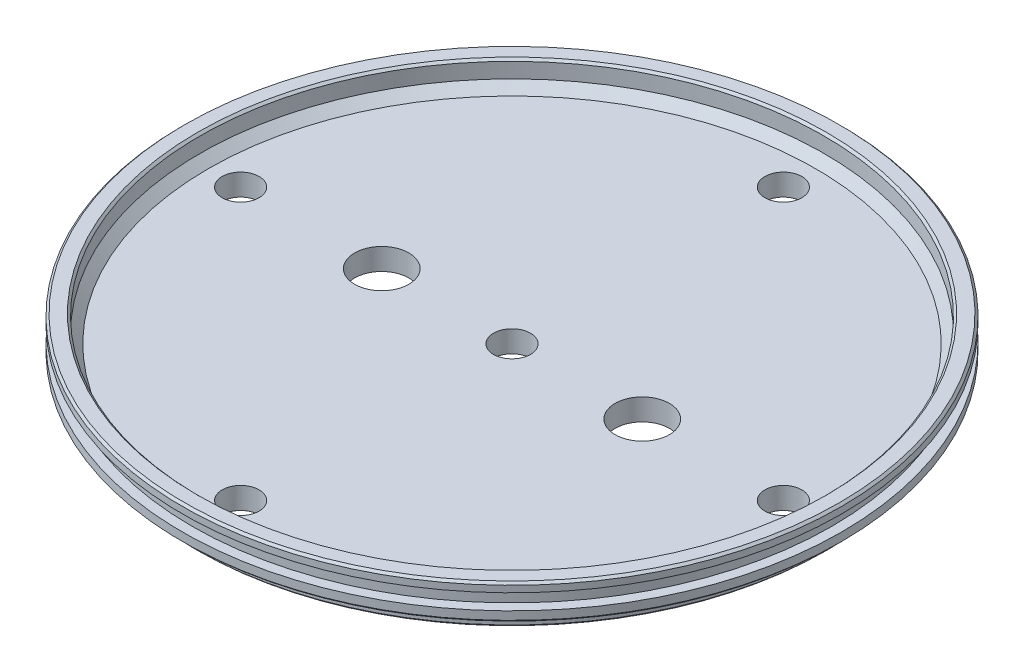
ISO-10303-21;
HEADER;
FILE_DESCRIPTION(('STEP AP214'),'2;1');
FILE_NAME('part.step','',(''),(''),'','','');
FILE_SCHEMA(('AUTOMOTIVE_DESIGN { 1 0 10303 214 1 1 1 1 }'));
ENDSEC;
DATA;
#1=APPLICATION_CONTEXT('core data for automotive mechanical design processes');
#2=APPLICATION_PROTOCOL_DEFINITION('international standard','automotive_design',2000,#1);
#3=PRODUCT_CONTEXT('',#1,'mechanical');
#4=PRODUCT('Part','Part','',(#3));
#5=PRODUCT_RELATED_PRODUCT_CATEGORY('part','',(#4));
#6=PRODUCT_DEFINITION_FORMATION('','',#4);
#7=PRODUCT_DEFINITION_CONTEXT('part definition',#1,'design');
#8=PRODUCT_DEFINITION('design','',#6,#7);
#9=PRODUCT_DEFINITION_SHAPE('','',#8);
#10=(LENGTH_UNIT() NAMED_UNIT(*) SI_UNIT(.MILLI.,.METRE.));
#11=(NAMED_UNIT(*) PLANE_ANGLE_UNIT() SI_UNIT($,.RADIAN.));
#12=(NAMED_UNIT(*) SI_UNIT($,.STERADIAN.) SOLID_ANGLE_UNIT());
#13=UNCERTAINTY_MEASURE_WITH_UNIT(LENGTH_MEASURE(1.E-05),#10,'distance_accuracy_value','');
#14=(GEOMETRIC_REPRESENTATION_CONTEXT(3) GLOBAL_UNCERTAINTY_ASSIGNED_CONTEXT((#13)) GLOBAL_UNIT_ASSIGNED_CONTEXT((#10,
#11,#12)) REPRESENTATION_CONTEXT('',''));
#15=CARTESIAN_POINT('',(0.,0.,0.));
#16=DIRECTION('',(0.,0.,1.));
#17=DIRECTION('',(1.,0.,0.));
#18=AXIS2_PLACEMENT_3D('',#15,#16,#17);
#19=CARTESIAN_POINT('',(-62.5,-209.735837716949,0.));
#20=DIRECTION('',(0.,1.,0.));
#21=DIRECTION('',(1.,0.,0.));
#22=AXIS2_PLACEMENT_3D('',#19,#20,#21);
#23=CYLINDRICAL_SURFACE('',#22,4.25);
#24=CARTESIAN_POINT('',(-62.5,5.,0.));
#25=DIRECTION('',(0.,-1.,0.));
#26=DIRECTION('',(1.,0.,0.));
#27=AXIS2_PLACEMENT_3D('',#24,#25,#26);
#28=CIRCLE('',#27,4.25);
#29=CARTESIAN_POINT('',(-58.25,5.,0.));
#30=VERTEX_POINT('',#29);
#31=CARTESIAN_POINT('',(-66.75,5.,0.));
#32=VERTEX_POINT('',#31);
#33=EDGE_CURVE('E179',#30,#32,#28,.T.);
#34=ORIENTED_EDGE('',*,*,#33,.F.);
#35=CARTESIAN_POINT('',(-62.5,5.,0.));
#36=DIRECTION('',(0.,-1.,0.));
#37=DIRECTION('',(1.,0.,0.));
#38=AXIS2_PLACEMENT_3D('',#35,#36,#37);
#39=CIRCLE('',#38,4.25);
#40=EDGE_CURVE('E174',#32,#30,#39,.T.);
#41=ORIENTED_EDGE('',*,*,#40,.F.);
#42=DIRECTION('',(0.,-1.,0.));
#43=VECTOR('',#42,1.);
#44=CARTESIAN_POINT('',(-66.75,-209.735837716949,0.));
#45=LINE('',#44,#43);
#46=CARTESIAN_POINT('',(-66.75,0.,0.));
#47=VERTEX_POINT('',#46);
#48=EDGE_CURVE('E12',#32,#47,#45,.T.);
#49=ORIENTED_EDGE('',*,*,#48,.T.);
#50=CARTESIAN_POINT('',(-62.5,0.,0.));
#51=DIRECTION('',(0.,1.,0.));
#52=DIRECTION('',(1.,0.,0.));
#53=AXIS2_PLACEMENT_3D('',#50,#51,#52);
#54=CIRCLE('',#53,4.25);
#55=EDGE_CURVE('E181',#47,#47,#54,.T.);
#56=ORIENTED_EDGE('',*,*,#55,.F.);
#57=ORIENTED_EDGE('',*,*,#48,.F.);
#58=EDGE_LOOP('',(#34,#41,#49,#56,#57));
#59=FACE_BOUND('',#58,.T.);
#60=ADVANCED_FACE('F51',(#59),#23,.F.);
#61=CARTESIAN_POINT('',(0.,-209.735837716949,62.5));
#62=DIRECTION('',(0.,1.,0.));
#63=DIRECTION('',(0.,0.,-1.));
#64=AXIS2_PLACEMENT_3D('',#61,#62,#63);
#65=CYLINDRICAL_SURFACE('',#64,4.25);
#66=CARTESIAN_POINT('',(0.,5.,62.5));
#67=DIRECTION('',(0.,-1.,0.));
#68=DIRECTION('',(0.,0.,-1.));
#69=AXIS2_PLACEMENT_3D('',#66,#67,#68);
#70=CIRCLE('',#69,4.25);
#71=CARTESIAN_POINT('',(0.,5.,58.25));
#72=VERTEX_POINT('',#71);
#73=CARTESIAN_POINT('',(0.,5.,66.75));
#74=VERTEX_POINT('',#73);
#75=EDGE_CURVE('E182',#72,#74,#70,.T.);
#76=ORIENTED_EDGE('',*,*,#75,.F.);
#77=CARTESIAN_POINT('',(0.,5.,62.5));
#78=DIRECTION('',(0.,-1.,0.));
#79=DIRECTION('',(0.,0.,-1.));
#80=AXIS2_PLACEMENT_3D('',#77,#78,#79);
#81=CIRCLE('',#80,4.25);
#82=EDGE_CURVE('E240',#74,#72,#81,.T.);
#83=ORIENTED_EDGE('',*,*,#82,.F.);
#84=DIRECTION('',(0.,-1.,0.));
#85=VECTOR('',#84,1.);
#86=CARTESIAN_POINT('',(0.,-209.735837716949,66.75));
#87=LINE('',#86,#85);
#88=CARTESIAN_POINT('',(0.,0.,66.75));
#89=VERTEX_POINT('',#88);
#90=EDGE_CURVE('E61',#74,#89,#87,.T.);
#91=ORIENTED_EDGE('',*,*,#90,.T.);
#92=CARTESIAN_POINT('',(0.,0.,62.5));
#93=DIRECTION('',(0.,1.,0.));
#94=DIRECTION('',(0.,0.,-1.));
#95=AXIS2_PLACEMENT_3D('',#92,#93,#94);
#96=CIRCLE('',#95,4.25);
#97=EDGE_CURVE('E255',#89,#89,#96,.T.);
#98=ORIENTED_EDGE('',*,*,#97,.F.);
#99=ORIENTED_EDGE('',*,*,#90,.F.);
#100=EDGE_LOOP('',(#76,#83,#91,#98,#99));
#101=FACE_BOUND('',#100,.T.);
#102=ADVANCED_FACE('F370',(#101),#65,.F.);
#103=CARTESIAN_POINT('',(62.5,-209.735837716949,0.));
#104=DIRECTION('',(0.,1.,0.));
#105=DIRECTION('',(-1.,0.,0.));
#106=AXIS2_PLACEMENT_3D('',#103,#104,#105);
#107=CYLINDRICAL_SURFACE('',#106,4.25);
#108=CARTESIAN_POINT('',(62.5,5.,0.));
#109=DIRECTION('',(0.,-1.,0.));
#110=DIRECTION('',(-1.,0.,0.));
#111=AXIS2_PLACEMENT_3D('',#108,#109,#110);
#112=CIRCLE('',#111,4.25);
#113=CARTESIAN_POINT('',(58.25,5.,0.));
#114=VERTEX_POINT('',#113);
#115=CARTESIAN_POINT('',(66.75,5.,0.));
#116=VERTEX_POINT('',#115);
#117=EDGE_CURVE('E234',#114,#116,#112,.T.);
#118=ORIENTED_EDGE('',*,*,#117,.F.);
#119=CARTESIAN_POINT('',(62.5,5.,0.));
#120=DIRECTION('',(0.,-1.,0.));
#121=DIRECTION('',(-1.,0.,0.));
#122=AXIS2_PLACEMENT_3D('',#119,#120,#121);
#123=CIRCLE('',#122,4.25);
#124=EDGE_CURVE('E239',#116,#114,#123,.T.);
#125=ORIENTED_EDGE('',*,*,#124,.F.);
#126=DIRECTION('',(0.,-1.,0.));
#127=VECTOR('',#126,1.);
#128=CARTESIAN_POINT('',(66.75,-209.735837716949,0.));
#129=LINE('',#128,#127);
#130=CARTESIAN_POINT('',(66.75,0.,0.));
#131=VERTEX_POINT('',#130);
#132=EDGE_CURVE('E55',#116,#131,#129,.T.);
#133=ORIENTED_EDGE('',*,*,#132,.T.);
#134=CARTESIAN_POINT('',(62.5,0.,0.));
#135=DIRECTION('',(0.,1.,0.));
#136=DIRECTION('',(-1.,0.,0.));
#137=AXIS2_PLACEMENT_3D('',#134,#135,#136);
#138=CIRCLE('',#137,4.25);
#139=EDGE_CURVE('E309',#131,#131,#138,.T.);
#140=ORIENTED_EDGE('',*,*,#139,.F.);
#141=ORIENTED_EDGE('',*,*,#132,.F.);
#142=EDGE_LOOP('',(#118,#125,#133,#140,#141));
#143=FACE_BOUND('',#142,.T.);
#144=ADVANCED_FACE('F375',(#143),#107,.F.);
#145=CARTESIAN_POINT('',(0.,-209.735837716949,-62.5));
#146=DIRECTION('',(0.,1.,0.));
#147=DIRECTION('',(0.,0.,1.));
#148=AXIS2_PLACEMENT_3D('',#145,#146,#147);
#149=CYLINDRICAL_SURFACE('',#148,4.25);
#150=CARTESIAN_POINT('',(0.,5.,-62.5));
#151=DIRECTION('',(0.,-1.,0.));
#152=DIRECTION('',(0.,0.,1.));
#153=AXIS2_PLACEMENT_3D('',#150,#151,#152);
#154=CIRCLE('',#153,4.25);
#155=CARTESIAN_POINT('',(0.,5.,-58.25));
#156=VERTEX_POINT('',#155);
#157=CARTESIAN_POINT('',(0.,5.,-66.75));
#158=VERTEX_POINT('',#157);
#159=EDGE_CURVE('E254',#156,#158,#154,.T.);
#160=ORIENTED_EDGE('',*,*,#159,.F.);
#161=CARTESIAN_POINT('',(0.,5.,-62.5));
#162=DIRECTION('',(0.,-1.,0.));
#163=DIRECTION('',(0.,0.,1.));
#164=AXIS2_PLACEMENT_3D('',#161,#162,#163);
#165=CIRCLE('',#164,4.25);
#166=EDGE_CURVE('E318',#158,#156,#165,.T.);
#167=ORIENTED_EDGE('',*,*,#166,.F.);
#168=DIRECTION('',(0.,-1.,0.));
#169=VECTOR('',#168,1.);
#170=CARTESIAN_POINT('',(0.,-209.735837716949,-66.75));
#171=LINE('',#170,#169);
#172=CARTESIAN_POINT('',(0.,0.,-66.75));
#173=VERTEX_POINT('',#172);
#174=EDGE_CURVE('E290',#158,#173,#171,.T.);
#175=ORIENTED_EDGE('',*,*,#174,.T.);
#176=CARTESIAN_POINT('',(0.,0.,-62.5));
#177=DIRECTION('',(0.,1.,0.));
#178=DIRECTION('',(0.,0.,1.));
#179=AXIS2_PLACEMENT_3D('',#176,#177,#178);
#180=CIRCLE('',#179,4.25);
#181=EDGE_CURVE('E193',#173,#173,#180,.T.);
#182=ORIENTED_EDGE('',*,*,#181,.F.);
#183=ORIENTED_EDGE('',*,*,#174,.F.);
#184=EDGE_LOOP('',(#160,#167,#175,#182,#183));
#185=FACE_BOUND('',#184,.T.);
#186=ADVANCED_FACE('F399',(#185),#149,.F.);
#187=CARTESIAN_POINT('',(0.,-209.735837716949,0.));
#188=DIRECTION('',(0.,1.,0.));
#189=DIRECTION('',(1.,0.,0.));
#190=AXIS2_PLACEMENT_3D('',#187,#188,#189);
#191=CYLINDRICAL_SURFACE('',#190,4.25);
#192=CARTESIAN_POINT('',(0.,5.,0.));
#193=DIRECTION('',(0.,-1.,0.));
#194=DIRECTION('',(1.,0.,0.));
#195=AXIS2_PLACEMENT_3D('',#192,#193,#194);
#196=CIRCLE('',#195,4.25);
#197=CARTESIAN_POINT('',(4.25,5.,0.));
#198=VERTEX_POINT('',#197);
#199=CARTESIAN_POINT('',(-4.25,5.,0.));
#200=VERTEX_POINT('',#199);
#201=EDGE_CURVE('E208',#198,#200,#196,.T.);
#202=ORIENTED_EDGE('',*,*,#201,.F.);
#203=CARTESIAN_POINT('',(0.,5.,0.));
#204=DIRECTION('',(0.,-1.,0.));
#205=DIRECTION('',(1.,0.,0.));
#206=AXIS2_PLACEMENT_3D('',#203,#204,#205);
#207=CIRCLE('',#206,4.25);
#208=EDGE_CURVE('E306',#200,#198,#207,.T.);
#209=ORIENTED_EDGE('',*,*,#208,.F.);
#210=DIRECTION('',(0.,-1.,0.));
#211=VECTOR('',#210,1.);
#212=CARTESIAN_POINT('',(-4.25,-209.735837716949,0.));
#213=LINE('',#212,#211);
#214=CARTESIAN_POINT('',(-4.25,0.,0.));
#215=VERTEX_POINT('',#214);
#216=EDGE_CURVE('E289',#200,#215,#213,.T.);
#217=ORIENTED_EDGE('',*,*,#216,.T.);
#218=CARTESIAN_POINT('',(0.,0.,0.));
#219=DIRECTION('',(0.,1.,0.));
#220=DIRECTION('',(1.,0.,0.));
#221=AXIS2_PLACEMENT_3D('',#218,#219,#220);
#222=CIRCLE('',#221,4.25);
#223=EDGE_CURVE('E217',#215,#215,#222,.T.);
#224=ORIENTED_EDGE('',*,*,#223,.F.);
#225=ORIENTED_EDGE('',*,*,#216,.F.);
#226=EDGE_LOOP('',(#202,#209,#217,#224,#225));
#227=FACE_BOUND('',#226,.T.);
#228=ADVANCED_FACE('F385',(#227),#191,.F.);
#229=CARTESIAN_POINT('',(-75.9,9.,0.));
#230=DIRECTION('',(0.,1.,0.));
#231=DIRECTION('',(1.,0.,0.));
#232=AXIS2_PLACEMENT_3D('',#229,#230,#231);
#233=PLANE('',#232);
#234=CARTESIAN_POINT('',(0.,9.,0.));
#235=DIRECTION('',(0.,-1.,0.));
#236=DIRECTION('',(1.,0.,0.));
#237=AXIS2_PLACEMENT_3D('',#234,#235,#236);
#238=CIRCLE('',#237,73.65);
#239=CARTESIAN_POINT('',(-73.65,9.,0.));
#240=VERTEX_POINT('',#239);
#241=CARTESIAN_POINT('',(73.65,9.,0.));
#242=VERTEX_POINT('',#241);
#243=EDGE_CURVE('E281',#240,#242,#238,.T.);
#244=ORIENTED_EDGE('',*,*,#243,.F.);
#245=CARTESIAN_POINT('',(0.,9.,0.));
#246=DIRECTION('',(0.,-1.,0.));
#247=DIRECTION('',(1.,0.,0.));
#248=AXIS2_PLACEMENT_3D('',#245,#246,#247);
#249=CIRCLE('',#248,73.65);
#250=EDGE_CURVE('E69',#242,#240,#249,.T.);
#251=ORIENTED_EDGE('',*,*,#250,.F.);
#252=EDGE_LOOP('',(#244,#251));
#253=FACE_BOUND('',#252,.T.);
#254=CARTESIAN_POINT('',(0.,9.,0.));
#255=DIRECTION('',(0.,1.,0.));
#256=DIRECTION('',(1.,0.,0.));
#257=AXIS2_PLACEMENT_3D('',#254,#255,#256);
#258=CIRCLE('',#257,75.9);
#259=CARTESIAN_POINT('',(-75.9,9.,0.));
#260=VERTEX_POINT('',#259);
#261=EDGE_CURVE('E270',#260,#260,#258,.T.);
#262=ORIENTED_EDGE('',*,*,#261,.F.);
#263=EDGE_LOOP('',(#262));
#264=FACE_BOUND('',#263,.T.);
#265=ADVANCED_FACE('F381',(#253,#264),#233,.F.);
#266=CARTESIAN_POINT('',(0.,7.2,0.));
#267=DIRECTION('',(0.,-1.,0.));
#268=DIRECTION('',(-1.,0.,0.));
#269=AXIS2_PLACEMENT_3D('',#266,#267,#268);
#270=CYLINDRICAL_SURFACE('',#269,73.65);
#271=ORIENTED_EDGE('',*,*,#243,.T.);
#272=DIRECTION('',(0.,-1.,0.));
#273=VECTOR('',#272,1.);
#274=CARTESIAN_POINT('',(73.65,7.2,0.));
#275=LINE('',#274,#273);
#276=CARTESIAN_POINT('',(73.65,5.4,0.));
#277=VERTEX_POINT('',#276);
#278=EDGE_CURVE('E305',#242,#277,#275,.T.);
#279=ORIENTED_EDGE('',*,*,#278,.T.);
#280=CARTESIAN_POINT('',(0.,5.4,0.));
#281=DIRECTION('',(0.,-1.,0.));
#282=DIRECTION('',(1.,0.,0.));
#283=AXIS2_PLACEMENT_3D('',#280,#281,#282);
#284=CIRCLE('',#283,73.65);
#285=CARTESIAN_POINT('',(-73.65,5.4,0.));
#286=VERTEX_POINT('',#285);
#287=EDGE_CURVE('E241',#286,#277,#284,.T.);
#288=ORIENTED_EDGE('',*,*,#287,.F.);
#289=CARTESIAN_POINT('',(0.,5.4,0.));
#290=DIRECTION('',(0.,-1.,0.));
#291=DIRECTION('',(1.,0.,0.));
#292=AXIS2_PLACEMENT_3D('',#289,#290,#291);
#293=CIRCLE('',#292,73.65);
#294=EDGE_CURVE('E280',#277,#286,#293,.T.);
#295=ORIENTED_EDGE('',*,*,#294,.F.);
#296=ORIENTED_EDGE('',*,*,#278,.F.);
#297=ORIENTED_EDGE('',*,*,#250,.T.);
#298=EDGE_LOOP('',(#271,#279,#288,#295,#296,#297));
#299=FACE_BOUND('',#298,.T.);
#300=ADVANCED_FACE('F384',(#299),#270,.T.);
#301=CARTESIAN_POINT('',(-73.65,5.4,0.));
#302=DIRECTION('',(0.,-1.,0.));
#303=DIRECTION('',(0.,0.,-1.));
#304=AXIS2_PLACEMENT_3D('',#301,#302,#303);
#305=PLANE('',#304);
#306=ORIENTED_EDGE('',*,*,#287,.T.);
#307=ORIENTED_EDGE('',*,*,#294,.T.);
#308=EDGE_LOOP('',(#306,#307));
#309=FACE_BOUND('',#308,.T.);
#310=CARTESIAN_POINT('',(0.,5.4,0.));
#311=DIRECTION('',(0.,-1.,0.));
#312=DIRECTION('',(1.,0.,0.));
#313=AXIS2_PLACEMENT_3D('',#310,#311,#312);
#314=CIRCLE('',#313,75.9);
#315=CARTESIAN_POINT('',(-75.9,5.4,0.));
#316=VERTEX_POINT('',#315);
#317=EDGE_CURVE('E215',#316,#316,#314,.T.);
#318=ORIENTED_EDGE('',*,*,#317,.F.);
#319=EDGE_LOOP('',(#318));
#320=FACE_BOUND('',#319,.T.);
#321=ADVANCED_FACE('F388',(#309,#320),#305,.F.);
#322=CARTESIAN_POINT('',(0.,0.,0.));
#323=DIRECTION('',(0.,1.,0.));
#324=DIRECTION('',(1.,0.,0.));
#325=AXIS2_PLACEMENT_3D('',#322,#323,#324);
#326=CYLINDRICAL_SURFACE('',#325,75.9);
#327=CARTESIAN_POINT('',(0.,10.5,0.));
#328=DIRECTION('',(0.,1.,0.));
#329=DIRECTION('',(-1.,0.,0.));
#330=AXIS2_PLACEMENT_3D('',#327,#328,#329);
#331=CIRCLE('',#330,75.9);
#332=CARTESIAN_POINT('',(75.9,10.5,0.));
#333=VERTEX_POINT('',#332);
#334=CARTESIAN_POINT('',(-75.9,10.5,0.));
#335=VERTEX_POINT('',#334);
#336=EDGE_CURVE('E226',#333,#335,#331,.T.);
#337=ORIENTED_EDGE('',*,*,#336,.F.);
#338=CARTESIAN_POINT('',(0.,10.5,0.));
#339=DIRECTION('',(0.,1.,0.));
#340=DIRECTION('',(-1.,0.,0.));
#341=AXIS2_PLACEMENT_3D('',#338,#339,#340);
#342=CIRCLE('',#341,75.9);
#343=EDGE_CURVE('E230',#335,#333,#342,.T.);
#344=ORIENTED_EDGE('',*,*,#343,.F.);
#345=DIRECTION('',(0.,-1.,0.));
#346=VECTOR('',#345,1.);
#347=CARTESIAN_POINT('',(-75.9,0.,0.));
#348=LINE('',#347,#346);
#349=EDGE_CURVE('E274',#335,#260,#348,.T.);
#350=ORIENTED_EDGE('',*,*,#349,.T.);
#351=ORIENTED_EDGE('',*,*,#261,.T.);
#352=ORIENTED_EDGE('',*,*,#349,.F.);
#353=EDGE_LOOP('',(#337,#344,#350,#351,#352));
#354=FACE_BOUND('',#353,.T.);
#355=ADVANCED_FACE('F348',(#354),#326,.T.);
#356=CARTESIAN_POINT('',(0.,10.75,0.));
#357=DIRECTION('',(0.,-1.,0.));
#358=DIRECTION('',(-1.,0.,0.));
#359=AXIS2_PLACEMENT_3D('',#356,#357,#358);
#360=CONICAL_SURFACE('',#359,75.65,0.785398163397446);
#361=CARTESIAN_POINT('',(0.,11.,0.));
#362=DIRECTION('',(0.,-1.,0.));
#363=DIRECTION('',(-1.,0.,0.));
#364=AXIS2_PLACEMENT_3D('',#361,#362,#363);
#365=CIRCLE('',#364,75.4);
#366=CARTESIAN_POINT('',(75.4,11.,0.));
#367=VERTEX_POINT('',#366);
#368=EDGE_CURVE('E278',#367,#367,#365,.T.);
#369=ORIENTED_EDGE('',*,*,#368,.T.);
#370=DIRECTION('',(0.707106781186546,-0.707106781186549,0.));
#371=VECTOR('',#370,1.);
#372=CARTESIAN_POINT('',(75.65,10.75,0.));
#373=LINE('',#372,#371);
#374=EDGE_CURVE('E196',#367,#333,#373,.T.);
#375=ORIENTED_EDGE('',*,*,#374,.T.);
#376=ORIENTED_EDGE('',*,*,#336,.T.);
#377=ORIENTED_EDGE('',*,*,#343,.T.);
#378=ORIENTED_EDGE('',*,*,#374,.F.);
#379=EDGE_LOOP('',(#369,#375,#376,#377,#378));
#380=FACE_BOUND('',#379,.T.);
#381=ADVANCED_FACE('F343',(#380),#360,.T.);
#382=CARTESIAN_POINT('',(0.,11.,0.));
#383=DIRECTION('',(0.,1.,0.));
#384=DIRECTION('',(1.,0.,0.));
#385=AXIS2_PLACEMENT_3D('',#382,#383,#384);
#386=PLANE('',#385);
#387=CARTESIAN_POINT('',(0.,11.,0.));
#388=DIRECTION('',(0.,1.,0.));
#389=DIRECTION('',(-1.,0.,0.));
#390=AXIS2_PLACEMENT_3D('',#387,#388,#389);
#391=CIRCLE('',#390,72.4);
#392=CARTESIAN_POINT('',(72.4,11.,0.));
#393=VERTEX_POINT('',#392);
#394=EDGE_CURVE('E279',#393,#393,#391,.T.);
#395=ORIENTED_EDGE('',*,*,#394,.F.);
#396=EDGE_LOOP('',(#395));
#397=FACE_BOUND('',#396,.T.);
#398=ORIENTED_EDGE('',*,*,#368,.F.);
#399=EDGE_LOOP('',(#398));
#400=FACE_BOUND('',#399,.T.);
#401=ADVANCED_FACE('F397',(#397,#400),#386,.T.);
#402=CARTESIAN_POINT('',(0.,10.75,0.));
#403=DIRECTION('',(0.,1.,0.));
#404=DIRECTION('',(-1.,0.,0.));
#405=AXIS2_PLACEMENT_3D('',#402,#403,#404);
#406=CONICAL_SURFACE('',#405,72.15,0.785398163397446);
#407=ORIENTED_EDGE('',*,*,#394,.T.);
#408=DIRECTION('',(-0.707106781186546,-0.707106781186549,0.));
#409=VECTOR('',#408,1.);
#410=CARTESIAN_POINT('',(72.15,10.75,0.));
#411=LINE('',#410,#409);
#412=CARTESIAN_POINT('',(71.9,10.5,0.));
#413=VERTEX_POINT('',#412);
#414=EDGE_CURVE('E276',#393,#413,#411,.T.);
#415=ORIENTED_EDGE('',*,*,#414,.T.);
#416=CARTESIAN_POINT('',(0.,10.5,0.));
#417=DIRECTION('',(0.,-1.,0.));
#418=DIRECTION('',(-1.,0.,0.));
#419=AXIS2_PLACEMENT_3D('',#416,#417,#418);
#420=CIRCLE('',#419,71.9);
#421=EDGE_CURVE('E186',#413,#413,#420,.T.);
#422=ORIENTED_EDGE('',*,*,#421,.T.);
#423=ORIENTED_EDGE('',*,*,#414,.F.);
#424=EDGE_LOOP('',(#407,#415,#422,#423));
#425=FACE_BOUND('',#424,.T.);
#426=ADVANCED_FACE('F53',(#425),#406,.F.);
#427=CARTESIAN_POINT('',(0.,0.,0.));
#428=DIRECTION('',(0.,1.,0.));
#429=DIRECTION('',(1.,0.,0.));
#430=AXIS2_PLACEMENT_3D('',#427,#428,#429);
#431=PLANE('',#430);
#432=CARTESIAN_POINT('',(30.,0.,0.));
#433=DIRECTION('',(0.,1.,0.));
#434=DIRECTION('',(0.,0.,1.));
#435=AXIS2_PLACEMENT_3D('',#432,#433,#434);
#436=CIRCLE('',#435,6.25);
#437=CARTESIAN_POINT('',(30.,0.,6.25));
#438=VERTEX_POINT('',#437);
#439=EDGE_CURVE('E646',#438,#438,#436,.F.);
#440=ORIENTED_EDGE('',*,*,#439,.F.);
#441=EDGE_LOOP('',(#440));
#442=FACE_BOUND('',#441,.T.);
#443=CARTESIAN_POINT('',(-30.,0.,0.));
#444=DIRECTION('',(0.,1.,0.));
#445=DIRECTION('',(0.,0.,1.));
#446=AXIS2_PLACEMENT_3D('',#443,#444,#445);
#447=CIRCLE('',#446,6.25);
#448=CARTESIAN_POINT('',(-30.,0.,6.25));
#449=VERTEX_POINT('',#448);
#450=EDGE_CURVE('E263',#449,#449,#447,.T.);
#451=ORIENTED_EDGE('',*,*,#450,.T.);
#452=EDGE_LOOP('',(#451));
#453=FACE_BOUND('',#452,.T.);
#454=ORIENTED_EDGE('',*,*,#223,.T.);
#455=EDGE_LOOP('',(#454));
#456=FACE_BOUND('',#455,.T.);
#457=ORIENTED_EDGE('',*,*,#181,.T.);
#458=EDGE_LOOP('',(#457));
#459=FACE_BOUND('',#458,.T.);
#460=ORIENTED_EDGE('',*,*,#139,.T.);
#461=EDGE_LOOP('',(#460));
#462=FACE_BOUND('',#461,.T.);
#463=ORIENTED_EDGE('',*,*,#97,.T.);
#464=EDGE_LOOP('',(#463));
#465=FACE_BOUND('',#464,.T.);
#466=ORIENTED_EDGE('',*,*,#55,.T.);
#467=EDGE_LOOP('',(#466));
#468=FACE_BOUND('',#467,.T.);
#469=CARTESIAN_POINT('',(0.,0.,0.));
#470=DIRECTION('',(0.,1.,0.));
#471=DIRECTION('',(-1.,0.,0.));
#472=AXIS2_PLACEMENT_3D('',#469,#470,#471);
#473=CIRCLE('',#472,72.45);
#474=CARTESIAN_POINT('',(72.45,0.,0.));
#475=VERTEX_POINT('',#474);
#476=EDGE_CURVE('E332',#475,#475,#473,.T.);
#477=ORIENTED_EDGE('',*,*,#476,.F.);
#478=EDGE_LOOP('',(#477));
#479=FACE_BOUND('',#478,.T.);
#480=ADVANCED_FACE('F464',(#442,#453,#456,#459,#462,#465,#468,#479),#431,.F.);
#481=CARTESIAN_POINT('',(0.,0.,0.));
#482=DIRECTION('',(0.,1.,0.));
#483=DIRECTION('',(-1.,0.,0.));
#484=AXIS2_PLACEMENT_3D('',#481,#482,#483);
#485=CYLINDRICAL_SURFACE('',#484,72.95);
#486=CARTESIAN_POINT('',(0.,3.,0.));
#487=DIRECTION('',(0.,-1.,0.));
#488=DIRECTION('',(-1.,0.,0.));
#489=AXIS2_PLACEMENT_3D('',#486,#487,#488);
#490=CIRCLE('',#489,72.95);
#491=CARTESIAN_POINT('',(72.95,3.,0.));
#492=VERTEX_POINT('',#491);
#493=EDGE_CURVE('E211',#492,#492,#490,.T.);
#494=ORIENTED_EDGE('',*,*,#493,.T.);
#495=DIRECTION('',(0.,-1.,0.));
#496=VECTOR('',#495,1.);
#497=CARTESIAN_POINT('',(72.95,0.,0.));
#498=LINE('',#497,#496);
#499=CARTESIAN_POINT('',(72.95,0.5,0.));
#500=VERTEX_POINT('',#499);
#501=EDGE_CURVE('E258',#492,#500,#498,.T.);
#502=ORIENTED_EDGE('',*,*,#501,.T.);
#503=CARTESIAN_POINT('',(0.,0.5,0.));
#504=DIRECTION('',(0.,-1.,0.));
#505=DIRECTION('',(-1.,0.,0.));
#506=AXIS2_PLACEMENT_3D('',#503,#504,#505);
#507=CIRCLE('',#506,72.95);
#508=EDGE_CURVE('E260',#500,#500,#507,.T.);
#509=ORIENTED_EDGE('',*,*,#508,.F.);
#510=ORIENTED_EDGE('',*,*,#501,.F.);
#511=EDGE_LOOP('',(#494,#502,#509,#510));
#512=FACE_BOUND('',#511,.T.);
#513=ADVANCED_FACE('F421',(#512),#485,.T.);
#514=CARTESIAN_POINT('',(0.,0.25,0.));
#515=DIRECTION('',(0.,1.,0.));
#516=DIRECTION('',(-1.,0.,0.));
#517=AXIS2_PLACEMENT_3D('',#514,#515,#516);
#518=CONICAL_SURFACE('',#517,72.7,0.785398163397447);
#519=ORIENTED_EDGE('',*,*,#476,.T.);
#520=DIRECTION('',(0.707106781186546,0.707106781186549,0.));
#521=VECTOR('',#520,1.);
#522=CARTESIAN_POINT('',(72.7,0.25,0.));
#523=LINE('',#522,#521);
#524=EDGE_CURVE('E287',#475,#500,#523,.T.);
#525=ORIENTED_EDGE('',*,*,#524,.T.);
#526=ORIENTED_EDGE('',*,*,#508,.T.);
#527=ORIENTED_EDGE('',*,*,#524,.F.);
#528=EDGE_LOOP('',(#519,#525,#526,#527));
#529=FACE_BOUND('',#528,.T.);
#530=ADVANCED_FACE('F393',(#529),#518,.T.);
#531=CARTESIAN_POINT('',(0.,0.,0.));
#532=DIRECTION('',(0.,1.,0.));
#533=DIRECTION('',(1.,0.,0.));
#534=AXIS2_PLACEMENT_3D('',#531,#532,#533);
#535=CYLINDRICAL_SURFACE('',#534,75.9);
#536=ORIENTED_EDGE('',*,*,#317,.T.);
#537=DIRECTION('',(0.,-1.,0.));
#538=VECTOR('',#537,1.);
#539=CARTESIAN_POINT('',(-75.9,0.,0.));
#540=LINE('',#539,#538);
#541=CARTESIAN_POINT('',(-75.9,3.5,0.));
#542=VERTEX_POINT('',#541);
#543=EDGE_CURVE('E275',#316,#542,#540,.T.);
#544=ORIENTED_EDGE('',*,*,#543,.T.);
#545=CARTESIAN_POINT('',(0.,3.5,0.));
#546=DIRECTION('',(0.,-1.,0.));
#547=DIRECTION('',(-1.,0.,0.));
#548=AXIS2_PLACEMENT_3D('',#545,#546,#547);
#549=CIRCLE('',#548,75.9);
#550=CARTESIAN_POINT('',(75.9,3.5,0.));
#551=VERTEX_POINT('',#550);
#552=EDGE_CURVE('E299',#551,#542,#549,.T.);
#553=ORIENTED_EDGE('',*,*,#552,.F.);
#554=CARTESIAN_POINT('',(0.,3.5,0.));
#555=DIRECTION('',(0.,-1.,0.));
#556=DIRECTION('',(-1.,0.,0.));
#557=AXIS2_PLACEMENT_3D('',#554,#555,#556);
#558=CIRCLE('',#557,75.9);
#559=EDGE_CURVE('E296',#542,#551,#558,.T.);
#560=ORIENTED_EDGE('',*,*,#559,.F.);
#561=ORIENTED_EDGE('',*,*,#543,.F.);
#562=EDGE_LOOP('',(#536,#544,#553,#560,#561));
#563=FACE_BOUND('',#562,.T.);
#564=ADVANCED_FACE('F390',(#563),#535,.T.);
#565=CARTESIAN_POINT('',(0.,3.,0.));
#566=DIRECTION('',(0.,1.,0.));
#567=DIRECTION('',(1.,0.,0.));
#568=AXIS2_PLACEMENT_3D('',#565,#566,#567);
#569=PLANE('',#568);
#570=ORIENTED_EDGE('',*,*,#493,.F.);
#571=EDGE_LOOP('',(#570));
#572=FACE_BOUND('',#571,.T.);
#573=CARTESIAN_POINT('',(0.,3.,0.));
#574=DIRECTION('',(0.,1.,0.));
#575=DIRECTION('',(-1.,0.,0.));
#576=AXIS2_PLACEMENT_3D('',#573,#574,#575);
#577=CIRCLE('',#576,75.4);
#578=CARTESIAN_POINT('',(75.4,3.,0.));
#579=VERTEX_POINT('',#578);
#580=EDGE_CURVE('E216',#579,#579,#577,.T.);
#581=ORIENTED_EDGE('',*,*,#580,.F.);
#582=EDGE_LOOP('',(#581));
#583=FACE_BOUND('',#582,.T.);
#584=ADVANCED_FACE('F363',(#572,#583),#569,.F.);
#585=CARTESIAN_POINT('',(0.,3.25,0.));
#586=DIRECTION('',(0.,1.,0.));
#587=DIRECTION('',(-1.,0.,0.));
#588=AXIS2_PLACEMENT_3D('',#585,#586,#587);
#589=CONICAL_SURFACE('',#588,75.65,0.785398163397447);
#590=ORIENTED_EDGE('',*,*,#552,.T.);
#591=ORIENTED_EDGE('',*,*,#559,.T.);
#592=DIRECTION('',(-0.707106781186546,-0.707106781186549,0.));
#593=VECTOR('',#592,1.);
#594=CARTESIAN_POINT('',(75.65,3.25,0.));
#595=LINE('',#594,#593);
#596=EDGE_CURVE('E292',#551,#579,#595,.T.);
#597=ORIENTED_EDGE('',*,*,#596,.T.);
#598=ORIENTED_EDGE('',*,*,#580,.T.);
#599=ORIENTED_EDGE('',*,*,#596,.F.);
#600=EDGE_LOOP('',(#590,#591,#597,#598,#599));
#601=FACE_BOUND('',#600,.T.);
#602=ADVANCED_FACE('F355',(#601),#589,.T.);
#603=CARTESIAN_POINT('',(0.,5.,0.));
#604=DIRECTION('',(0.,1.,0.));
#605=DIRECTION('',(1.,0.,0.));
#606=AXIS2_PLACEMENT_3D('',#603,#604,#605);
#607=PLANE('',#606);
#608=CARTESIAN_POINT('',(30.,5.,0.));
#609=DIRECTION('',(0.,-1.,0.));
#610=DIRECTION('',(0.,0.,1.));
#611=AXIS2_PLACEMENT_3D('',#608,#609,#610);
#612=CIRCLE('',#611,6.25);
#613=CARTESIAN_POINT('',(30.,5.,6.25));
#614=VERTEX_POINT('',#613);
#615=EDGE_CURVE('E643',#614,#614,#612,.T.);
#616=ORIENTED_EDGE('',*,*,#615,.T.);
#617=EDGE_LOOP('',(#616));
#618=FACE_BOUND('',#617,.T.);
#619=CARTESIAN_POINT('',(-30.,5.,0.));
#620=DIRECTION('',(0.,1.,0.));
#621=DIRECTION('',(0.,0.,1.));
#622=AXIS2_PLACEMENT_3D('',#619,#620,#621);
#623=CIRCLE('',#622,6.25);
#624=CARTESIAN_POINT('',(-30.,5.,6.25));
#625=VERTEX_POINT('',#624);
#626=EDGE_CURVE('E647',#625,#625,#623,.T.);
#627=ORIENTED_EDGE('',*,*,#626,.F.);
#628=EDGE_LOOP('',(#627));
#629=FACE_BOUND('',#628,.T.);
#630=ORIENTED_EDGE('',*,*,#201,.T.);
#631=ORIENTED_EDGE('',*,*,#208,.T.);
#632=EDGE_LOOP('',(#630,#631));
#633=FACE_BOUND('',#632,.T.);
#634=ORIENTED_EDGE('',*,*,#159,.T.);
#635=ORIENTED_EDGE('',*,*,#166,.T.);
#636=EDGE_LOOP('',(#634,#635));
#637=FACE_BOUND('',#636,.T.);
#638=ORIENTED_EDGE('',*,*,#117,.T.);
#639=ORIENTED_EDGE('',*,*,#124,.T.);
#640=EDGE_LOOP('',(#638,#639));
#641=FACE_BOUND('',#640,.T.);
#642=ORIENTED_EDGE('',*,*,#75,.T.);
#643=ORIENTED_EDGE('',*,*,#82,.T.);
#644=EDGE_LOOP('',(#642,#643));
#645=FACE_BOUND('',#644,.T.);
#646=ORIENTED_EDGE('',*,*,#33,.T.);
#647=ORIENTED_EDGE('',*,*,#40,.T.);
#648=EDGE_LOOP('',(#646,#647));
#649=FACE_BOUND('',#648,.T.);
#650=CARTESIAN_POINT('',(0.,5.,0.));
#651=DIRECTION('',(0.,-1.,0.));
#652=DIRECTION('',(-1.,0.,0.));
#653=AXIS2_PLACEMENT_3D('',#650,#651,#652);
#654=CIRCLE('',#653,69.9);
#655=CARTESIAN_POINT('',(69.9,5.,0.));
#656=VERTEX_POINT('',#655);
#657=EDGE_CURVE('E261',#656,#656,#654,.T.);
#658=ORIENTED_EDGE('',*,*,#657,.F.);
#659=EDGE_LOOP('',(#658));
#660=FACE_BOUND('',#659,.T.);
#661=ADVANCED_FACE('F184',(#618,#629,#633,#637,#641,#645,#649,#660),#607,.T.);
#662=CARTESIAN_POINT('',(0.,5.,0.));
#663=DIRECTION('',(0.,1.,0.));
#664=DIRECTION('',(-1.,0.,0.));
#665=AXIS2_PLACEMENT_3D('',#662,#663,#664);
#666=CYLINDRICAL_SURFACE('',#665,71.9);
#667=CARTESIAN_POINT('',(0.,7.,0.));
#668=DIRECTION('',(0.,1.,0.));
#669=DIRECTION('',(-1.,0.,0.));
#670=AXIS2_PLACEMENT_3D('',#667,#668,#669);
#671=CIRCLE('',#670,71.9);
#672=CARTESIAN_POINT('',(71.9,7.,0.));
#673=VERTEX_POINT('',#672);
#674=EDGE_CURVE('E231',#673,#673,#671,.T.);
#675=ORIENTED_EDGE('',*,*,#674,.F.);
#676=DIRECTION('',(0.,1.,0.));
#677=VECTOR('',#676,1.);
#678=CARTESIAN_POINT('',(71.9,5.,0.));
#679=LINE('',#678,#677);
#680=EDGE_CURVE('E111',#673,#413,#679,.T.);
#681=ORIENTED_EDGE('',*,*,#680,.T.);
#682=ORIENTED_EDGE('',*,*,#421,.F.);
#683=ORIENTED_EDGE('',*,*,#680,.F.);
#684=EDGE_LOOP('',(#675,#681,#682,#683));
#685=FACE_BOUND('',#684,.T.);
#686=ADVANCED_FACE('F354',(#685),#666,.F.);
#687=CARTESIAN_POINT('',(0.,6.,0.));
#688=DIRECTION('',(0.,1.,0.));
#689=DIRECTION('',(-1.,0.,0.));
#690=AXIS2_PLACEMENT_3D('',#687,#688,#689);
#691=CONICAL_SURFACE('',#690,70.9,0.785398163397449);
#692=ORIENTED_EDGE('',*,*,#657,.T.);
#693=DIRECTION('',(0.707106781186548,0.707106781186547,0.));
#694=VECTOR('',#693,1.);
#695=CARTESIAN_POINT('',(70.9,6.,0.));
#696=LINE('',#695,#694);
#697=EDGE_CURVE('E120',#656,#673,#696,.T.);
#698=ORIENTED_EDGE('',*,*,#697,.T.);
#699=ORIENTED_EDGE('',*,*,#674,.T.);
#700=ORIENTED_EDGE('',*,*,#697,.F.);
#701=EDGE_LOOP('',(#692,#698,#699,#700));
#702=FACE_BOUND('',#701,.T.);
#703=ADVANCED_FACE('F351',(#702),#691,.F.);
#704=CARTESIAN_POINT('',(-30.,-5.,0.));
#705=DIRECTION('',(0.,1.,0.));
#706=DIRECTION('',(0.,0.,1.));
#707=AXIS2_PLACEMENT_3D('',#704,#705,#706);
#708=CYLINDRICAL_SURFACE('',#707,6.25);
#709=ORIENTED_EDGE('',*,*,#626,.T.);
#710=EDGE_LOOP('',(#709));
#711=FACE_BOUND('',#710,.T.);
#712=ORIENTED_EDGE('',*,*,#450,.F.);
#713=EDGE_LOOP('',(#712));
#714=FACE_BOUND('',#713,.T.);
#715=ADVANCED_FACE('F428',(#711,#714),#708,.F.);
#716=CARTESIAN_POINT('',(30.,-5.,0.));
#717=DIRECTION('',(0.,1.,0.));
#718=DIRECTION('',(0.,0.,1.));
#719=AXIS2_PLACEMENT_3D('',#716,#717,#718);
#720=CYLINDRICAL_SURFACE('',#719,6.25);
#721=ORIENTED_EDGE('',*,*,#615,.F.);
#722=EDGE_LOOP('',(#721));
#723=FACE_BOUND('',#722,.T.);
#724=ORIENTED_EDGE('',*,*,#439,.T.);
#725=EDGE_LOOP('',(#724));
#726=FACE_BOUND('',#725,.T.);
#727=ADVANCED_FACE('F613',(#723,#726),#720,.F.);
#728=CLOSED_SHELL('',(#60,#102,#144,#186,#228,#265,#300,#321,#355,#381,#401,#426,#480,#513,#530,
#564,#584,#602,#661,#686,#703,#715,#727));
#729=MANIFOLD_SOLID_BREP('B2',#728);
#730=ADVANCED_BREP_SHAPE_REPRESENTATION('',(#18,#729),#14);
#731=SHAPE_DEFINITION_REPRESENTATION(#9,#730);
ENDSEC;
END-ISO-10303-21;
